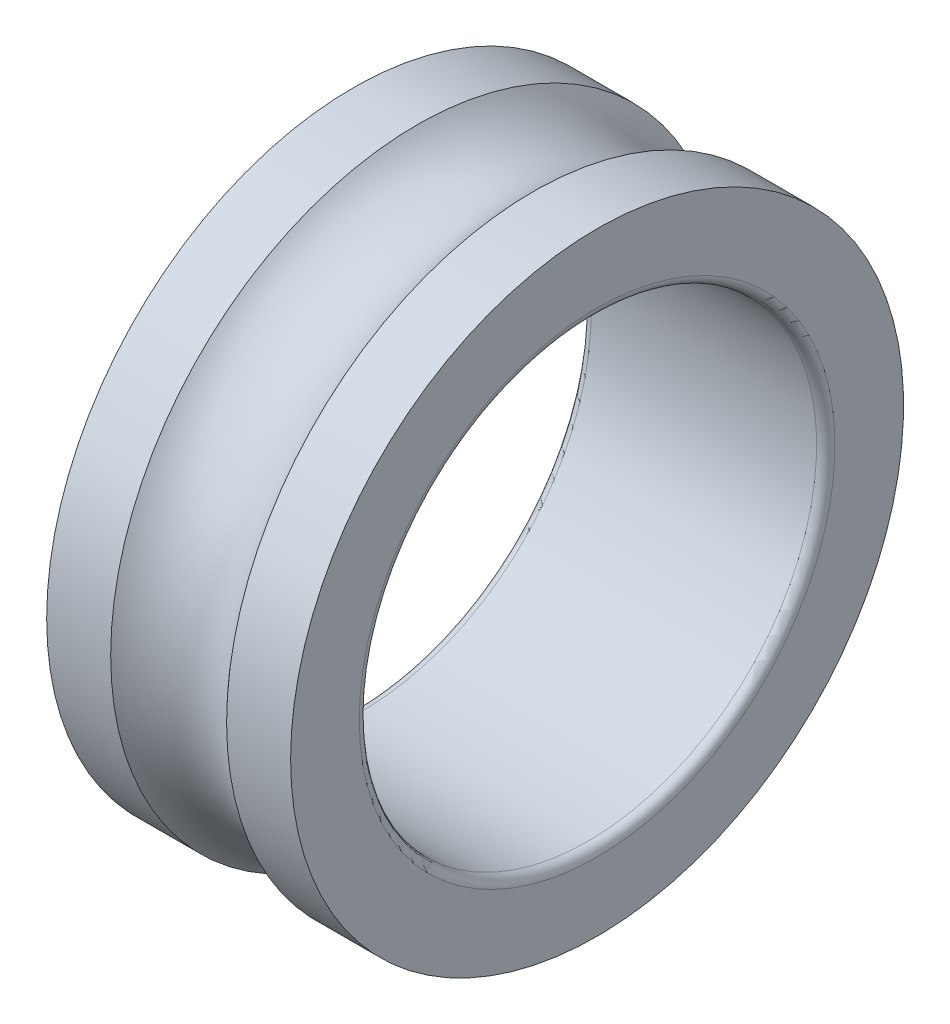
ISO-10303-21;
HEADER;
FILE_DESCRIPTION(('STEP AP214'),'2;1');
FILE_NAME('part.step','',(''),(''),'','','');
FILE_SCHEMA(('AUTOMOTIVE_DESIGN { 1 0 10303 214 1 1 1 1 }'));
ENDSEC;
DATA;
#1=APPLICATION_CONTEXT('core data for automotive mechanical design processes');
#2=APPLICATION_PROTOCOL_DEFINITION('international standard','automotive_design',2000,#1);
#3=PRODUCT_CONTEXT('',#1,'mechanical');
#4=PRODUCT('Part','Part','',(#3));
#5=PRODUCT_RELATED_PRODUCT_CATEGORY('part','',(#4));
#6=PRODUCT_DEFINITION_FORMATION('','',#4);
#7=PRODUCT_DEFINITION_CONTEXT('part definition',#1,'design');
#8=PRODUCT_DEFINITION('design','',#6,#7);
#9=PRODUCT_DEFINITION_SHAPE('','',#8);
#10=(LENGTH_UNIT() NAMED_UNIT(*) SI_UNIT(.MILLI.,.METRE.));
#11=(NAMED_UNIT(*) PLANE_ANGLE_UNIT() SI_UNIT($,.RADIAN.));
#12=(NAMED_UNIT(*) SI_UNIT($,.STERADIAN.) SOLID_ANGLE_UNIT());
#13=UNCERTAINTY_MEASURE_WITH_UNIT(LENGTH_MEASURE(1.E-05),#10,'distance_accuracy_value','');
#14=(GEOMETRIC_REPRESENTATION_CONTEXT(3) GLOBAL_UNCERTAINTY_ASSIGNED_CONTEXT((#13)) GLOBAL_UNIT_ASSIGNED_CONTEXT((#10,
#11,#12)) REPRESENTATION_CONTEXT('',''));
#15=CARTESIAN_POINT('',(0.,0.,0.));
#16=DIRECTION('',(0.,0.,1.));
#17=DIRECTION('',(1.,0.,0.));
#18=AXIS2_PLACEMENT_3D('',#15,#16,#17);
#19=CARTESIAN_POINT('',(0.300000000000001,0.,0.));
#20=DIRECTION('',(-1.,0.,0.));
#21=DIRECTION('',(0.,0.,1.));
#22=AXIS2_PLACEMENT_3D('',#19,#20,#21);
#23=TOROIDAL_SURFACE('',#22,7.8,0.300000000000001);
#24=CARTESIAN_POINT('',(0.300000000000001,0.,0.));
#25=DIRECTION('',(-1.,0.,0.));
#26=DIRECTION('',(0.,0.,1.));
#27=AXIS2_PLACEMENT_3D('',#24,#25,#26);
#28=CIRCLE('',#27,7.5);
#29=CARTESIAN_POINT('',(0.300000000000001,0.,7.5));
#30=VERTEX_POINT('',#29);
#31=EDGE_CURVE('E10',#30,#30,#28,.T.);
#32=ORIENTED_EDGE('',*,*,#31,.F.);
#33=EDGE_LOOP('',(#32));
#34=FACE_BOUND('',#33,.T.);
#35=CARTESIAN_POINT('',(0.,0.,0.));
#36=DIRECTION('',(-1.,0.,0.));
#37=DIRECTION('',(0.,0.,1.));
#38=AXIS2_PLACEMENT_3D('',#35,#36,#37);
#39=CIRCLE('',#38,7.8);
#40=CARTESIAN_POINT('',(0.,0.,7.8));
#41=VERTEX_POINT('',#40);
#42=EDGE_CURVE('E57',#41,#41,#39,.T.);
#43=ORIENTED_EDGE('',*,*,#42,.T.);
#44=EDGE_LOOP('',(#43));
#45=FACE_BOUND('',#44,.T.);
#46=ADVANCED_FACE('F29',(#34,#45),#23,.T.);
#47=CARTESIAN_POINT('',(0.,0.,0.));
#48=DIRECTION('',(-1.,0.,0.));
#49=DIRECTION('',(0.,0.,1.));
#50=AXIS2_PLACEMENT_3D('',#47,#48,#49);
#51=CYLINDRICAL_SURFACE('',#50,7.5);
#52=CARTESIAN_POINT('',(7.7,0.,0.));
#53=DIRECTION('',(-1.,0.,0.));
#54=DIRECTION('',(0.,0.,1.));
#55=AXIS2_PLACEMENT_3D('',#52,#53,#54);
#56=CIRCLE('',#55,7.5);
#57=CARTESIAN_POINT('',(7.7,0.,7.5));
#58=VERTEX_POINT('',#57);
#59=EDGE_CURVE('E35',#58,#58,#56,.T.);
#60=ORIENTED_EDGE('',*,*,#59,.F.);
#61=EDGE_LOOP('',(#60));
#62=FACE_BOUND('',#61,.T.);
#63=ORIENTED_EDGE('',*,*,#31,.T.);
#64=EDGE_LOOP('',(#63));
#65=FACE_BOUND('',#64,.T.);
#66=ADVANCED_FACE('F94',(#62,#65),#51,.F.);
#67=CARTESIAN_POINT('',(7.7,0.,0.));
#68=DIRECTION('',(-1.,0.,0.));
#69=DIRECTION('',(0.,0.,1.));
#70=AXIS2_PLACEMENT_3D('',#67,#68,#69);
#71=TOROIDAL_SURFACE('',#70,7.8,0.300000000000001);
#72=CARTESIAN_POINT('',(8.,0.,0.));
#73=DIRECTION('',(-1.,0.,0.));
#74=DIRECTION('',(0.,0.,1.));
#75=AXIS2_PLACEMENT_3D('',#72,#73,#74);
#76=CIRCLE('',#75,7.8);
#77=CARTESIAN_POINT('',(8.,0.,7.8));
#78=VERTEX_POINT('',#77);
#79=EDGE_CURVE('E39',#78,#78,#76,.T.);
#80=ORIENTED_EDGE('',*,*,#79,.F.);
#81=EDGE_LOOP('',(#80));
#82=FACE_BOUND('',#81,.T.);
#83=ORIENTED_EDGE('',*,*,#59,.T.);
#84=EDGE_LOOP('',(#83));
#85=FACE_BOUND('',#84,.T.);
#86=ADVANCED_FACE('F89',(#82,#85),#71,.T.);
#87=CARTESIAN_POINT('',(8.,0.,-10.05));
#88=DIRECTION('',(-1.,0.,0.));
#89=DIRECTION('',(0.,0.,1.));
#90=AXIS2_PLACEMENT_3D('',#87,#88,#89);
#91=PLANE('',#90);
#92=CARTESIAN_POINT('',(8.,0.,0.));
#93=DIRECTION('',(-1.,0.,0.));
#94=DIRECTION('',(0.,0.,1.));
#95=AXIS2_PLACEMENT_3D('',#92,#93,#94);
#96=CIRCLE('',#95,10.05);
#97=CARTESIAN_POINT('',(8.,0.,10.05));
#98=VERTEX_POINT('',#97);
#99=EDGE_CURVE('E43',#98,#98,#96,.T.);
#100=ORIENTED_EDGE('',*,*,#99,.F.);
#101=EDGE_LOOP('',(#100));
#102=FACE_BOUND('',#101,.T.);
#103=ORIENTED_EDGE('',*,*,#79,.T.);
#104=EDGE_LOOP('',(#103));
#105=FACE_BOUND('',#104,.T.);
#106=ADVANCED_FACE('F83',(#102,#105),#91,.F.);
#107=CARTESIAN_POINT('',(0.,0.,0.));
#108=DIRECTION('',(-1.,0.,0.));
#109=DIRECTION('',(0.,0.,1.));
#110=AXIS2_PLACEMENT_3D('',#107,#108,#109);
#111=CYLINDRICAL_SURFACE('',#110,10.05);
#112=CARTESIAN_POINT('',(5.90065778087482,0.,0.));
#113=DIRECTION('',(-1.,0.,0.));
#114=DIRECTION('',(0.,0.,1.));
#115=AXIS2_PLACEMENT_3D('',#112,#113,#114);
#116=CIRCLE('',#115,10.05);
#117=CARTESIAN_POINT('',(5.90065778087482,0.,10.05));
#118=VERTEX_POINT('',#117);
#119=EDGE_CURVE('E48',#118,#118,#116,.T.);
#120=ORIENTED_EDGE('',*,*,#119,.F.);
#121=EDGE_LOOP('',(#120));
#122=FACE_BOUND('',#121,.T.);
#123=ORIENTED_EDGE('',*,*,#99,.T.);
#124=EDGE_LOOP('',(#123));
#125=FACE_BOUND('',#124,.T.);
#126=ADVANCED_FACE('F77',(#122,#125),#111,.T.);
#127=CARTESIAN_POINT('',(4.,0.,0.));
#128=DIRECTION('',(-1.,0.,0.));
#129=DIRECTION('',(0.,0.,1.));
#130=AXIS2_PLACEMENT_3D('',#127,#128,#129);
#131=TOROIDAL_SURFACE('',#130,11.75,2.55);
#132=CARTESIAN_POINT('',(2.09934221912518,0.,0.));
#133=DIRECTION('',(-1.,0.,0.));
#134=DIRECTION('',(0.,0.,1.));
#135=AXIS2_PLACEMENT_3D('',#132,#133,#134);
#136=CIRCLE('',#135,10.05);
#137=CARTESIAN_POINT('',(2.09934221912518,0.,10.05));
#138=VERTEX_POINT('',#137);
#139=EDGE_CURVE('E51',#138,#138,#136,.T.);
#140=ORIENTED_EDGE('',*,*,#139,.F.);
#141=EDGE_LOOP('',(#140));
#142=FACE_BOUND('',#141,.T.);
#143=ORIENTED_EDGE('',*,*,#119,.T.);
#144=EDGE_LOOP('',(#143));
#145=FACE_BOUND('',#144,.T.);
#146=ADVANCED_FACE('F71',(#142,#145),#131,.F.);
#147=CARTESIAN_POINT('',(0.,0.,0.));
#148=DIRECTION('',(-1.,0.,0.));
#149=DIRECTION('',(0.,0.,1.));
#150=AXIS2_PLACEMENT_3D('',#147,#148,#149);
#151=CYLINDRICAL_SURFACE('',#150,10.05);
#152=CARTESIAN_POINT('',(0.,0.,0.));
#153=DIRECTION('',(-1.,0.,0.));
#154=DIRECTION('',(0.,0.,1.));
#155=AXIS2_PLACEMENT_3D('',#152,#153,#154);
#156=CIRCLE('',#155,10.05);
#157=CARTESIAN_POINT('',(0.,0.,10.05));
#158=VERTEX_POINT('',#157);
#159=EDGE_CURVE('E54',#158,#158,#156,.T.);
#160=ORIENTED_EDGE('',*,*,#159,.F.);
#161=EDGE_LOOP('',(#160));
#162=FACE_BOUND('',#161,.T.);
#163=ORIENTED_EDGE('',*,*,#139,.T.);
#164=EDGE_LOOP('',(#163));
#165=FACE_BOUND('',#164,.T.);
#166=ADVANCED_FACE('F65',(#162,#165),#151,.T.);
#167=CARTESIAN_POINT('',(0.,0.,-10.05));
#168=DIRECTION('',(1.,0.,0.));
#169=DIRECTION('',(0.,0.,-1.));
#170=AXIS2_PLACEMENT_3D('',#167,#168,#169);
#171=PLANE('',#170);
#172=ORIENTED_EDGE('',*,*,#42,.F.);
#173=EDGE_LOOP('',(#172));
#174=FACE_BOUND('',#173,.T.);
#175=ORIENTED_EDGE('',*,*,#159,.T.);
#176=EDGE_LOOP('',(#175));
#177=FACE_BOUND('',#176,.T.);
#178=ADVANCED_FACE('F62',(#174,#177),#171,.F.);
#179=CLOSED_SHELL('',(#46,#66,#86,#106,#126,#146,#166,#178));
#180=MANIFOLD_SOLID_BREP('B2',#179);
#181=ADVANCED_BREP_SHAPE_REPRESENTATION('',(#18,#180),#14);
#182=SHAPE_DEFINITION_REPRESENTATION(#9,#181);
ENDSEC;
END-ISO-10303-21;
